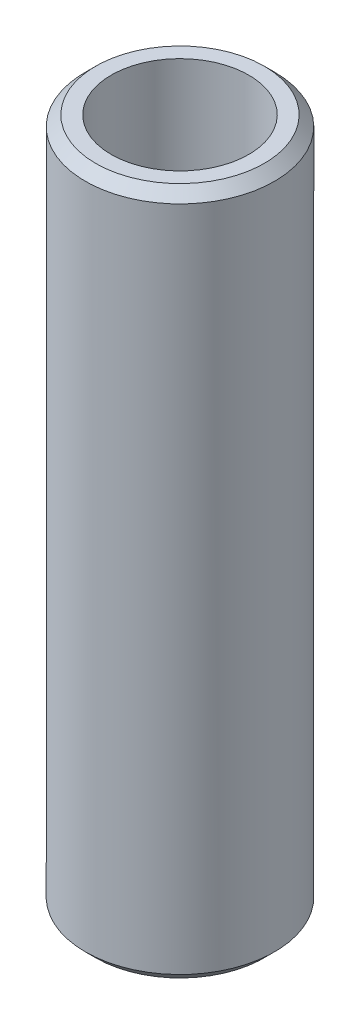
ISO-10303-21;
HEADER;
FILE_DESCRIPTION(('STEP AP214'),'2;1');
FILE_NAME('part.step','',(''),(''),'','','');
FILE_SCHEMA(('AUTOMOTIVE_DESIGN { 1 0 10303 214 1 1 1 1 }'));
ENDSEC;
DATA;
#1=APPLICATION_CONTEXT('core data for automotive mechanical design processes');
#2=APPLICATION_PROTOCOL_DEFINITION('international standard','automotive_design',2000,#1);
#3=PRODUCT_CONTEXT('',#1,'mechanical');
#4=PRODUCT('Part','Part','',(#3));
#5=PRODUCT_RELATED_PRODUCT_CATEGORY('part','',(#4));
#6=PRODUCT_DEFINITION_FORMATION('','',#4);
#7=PRODUCT_DEFINITION_CONTEXT('part definition',#1,'design');
#8=PRODUCT_DEFINITION('design','',#6,#7);
#9=PRODUCT_DEFINITION_SHAPE('','',#8);
#10=(LENGTH_UNIT() NAMED_UNIT(*) SI_UNIT(.MILLI.,.METRE.));
#11=(NAMED_UNIT(*) PLANE_ANGLE_UNIT() SI_UNIT($,.RADIAN.));
#12=(NAMED_UNIT(*) SI_UNIT($,.STERADIAN.) SOLID_ANGLE_UNIT());
#13=UNCERTAINTY_MEASURE_WITH_UNIT(LENGTH_MEASURE(1.E-05),#10,'distance_accuracy_value','');
#14=(GEOMETRIC_REPRESENTATION_CONTEXT(3) GLOBAL_UNCERTAINTY_ASSIGNED_CONTEXT((#13)) GLOBAL_UNIT_ASSIGNED_CONTEXT((#10,
#11,#12)) REPRESENTATION_CONTEXT('',''));
#15=CARTESIAN_POINT('',(0.,0.,0.));
#16=DIRECTION('',(0.,0.,1.));
#17=DIRECTION('',(1.,0.,0.));
#18=AXIS2_PLACEMENT_3D('',#15,#16,#17);
#19=CARTESIAN_POINT('',(0.,20.,0.));
#20=DIRECTION('',(0.,1.,0.));
#21=DIRECTION('',(0.,0.,1.));
#22=AXIS2_PLACEMENT_3D('',#19,#20,#21);
#23=PLANE('',#22);
#24=CARTESIAN_POINT('',(0.,20.,0.));
#25=DIRECTION('',(0.,1.,0.));
#26=DIRECTION('',(0.,0.,1.));
#27=AXIS2_PLACEMENT_3D('',#24,#25,#26);
#28=CIRCLE('',#27,2.44999999999999);
#29=CARTESIAN_POINT('',(0.,20.,-2.45));
#30=VERTEX_POINT('',#29);
#31=EDGE_CURVE('E10',#30,#30,#28,.T.);
#32=ORIENTED_EDGE('',*,*,#31,.T.);
#33=EDGE_LOOP('',(#32));
#34=FACE_BOUND('',#33,.T.);
#35=CARTESIAN_POINT('',(0.,20.,0.));
#36=DIRECTION('',(0.,1.,0.));
#37=DIRECTION('',(0.,0.,1.));
#38=AXIS2_PLACEMENT_3D('',#35,#36,#37);
#39=CIRCLE('',#38,2.);
#40=CARTESIAN_POINT('',(0.,20.,2.));
#41=VERTEX_POINT('',#40);
#42=EDGE_CURVE('E51',#41,#41,#39,.T.);
#43=ORIENTED_EDGE('',*,*,#42,.F.);
#44=EDGE_LOOP('',(#43));
#45=FACE_BOUND('',#44,.T.);
#46=ADVANCED_FACE('F31',(#34,#45),#23,.T.);
#47=CARTESIAN_POINT('',(0.,0.,0.));
#48=DIRECTION('',(0.,1.,0.));
#49=DIRECTION('',(0.,0.,1.));
#50=AXIS2_PLACEMENT_3D('',#47,#48,#49);
#51=PLANE('',#50);
#52=CARTESIAN_POINT('',(0.,0.,0.));
#53=DIRECTION('',(0.,1.,0.));
#54=DIRECTION('',(0.,0.,1.));
#55=AXIS2_PLACEMENT_3D('',#52,#53,#54);
#56=CIRCLE('',#55,2.45);
#57=CARTESIAN_POINT('',(0.,0.,2.45));
#58=VERTEX_POINT('',#57);
#59=EDGE_CURVE('E38',#58,#58,#56,.F.);
#60=ORIENTED_EDGE('',*,*,#59,.T.);
#61=EDGE_LOOP('',(#60));
#62=FACE_BOUND('',#61,.T.);
#63=CARTESIAN_POINT('',(0.,0.,0.));
#64=DIRECTION('',(0.,1.,0.));
#65=DIRECTION('',(0.,0.,1.));
#66=AXIS2_PLACEMENT_3D('',#63,#64,#65);
#67=CIRCLE('',#66,2.);
#68=CARTESIAN_POINT('',(0.,0.,2.));
#69=VERTEX_POINT('',#68);
#70=EDGE_CURVE('E52',#69,#69,#67,.T.);
#71=ORIENTED_EDGE('',*,*,#70,.T.);
#72=EDGE_LOOP('',(#71));
#73=FACE_BOUND('',#72,.T.);
#74=ADVANCED_FACE('F62',(#62,#73),#51,.F.);
#75=CARTESIAN_POINT('',(0.,20.,0.));
#76=DIRECTION('',(0.,-1.,0.));
#77=DIRECTION('',(0.,0.,-1.));
#78=AXIS2_PLACEMENT_3D('',#75,#76,#77);
#79=CYLINDRICAL_SURFACE('',#78,2.75);
#80=CARTESIAN_POINT('',(0.,0.299999999999998,0.));
#81=DIRECTION('',(0.,1.,0.));
#82=DIRECTION('',(0.,0.,1.));
#83=AXIS2_PLACEMENT_3D('',#80,#81,#82);
#84=CIRCLE('',#83,2.75);
#85=CARTESIAN_POINT('',(0.,0.299999999999998,2.75));
#86=VERTEX_POINT('',#85);
#87=EDGE_CURVE('E42',#86,#86,#84,.T.);
#88=ORIENTED_EDGE('',*,*,#87,.T.);
#89=EDGE_LOOP('',(#88));
#90=FACE_BOUND('',#89,.T.);
#91=CARTESIAN_POINT('',(0.,19.7,0.));
#92=DIRECTION('',(0.,1.,0.));
#93=DIRECTION('',(0.,0.,1.));
#94=AXIS2_PLACEMENT_3D('',#91,#92,#93);
#95=CIRCLE('',#94,2.75);
#96=CARTESIAN_POINT('',(0.,19.7,-2.75));
#97=VERTEX_POINT('',#96);
#98=EDGE_CURVE('E46',#97,#97,#95,.F.);
#99=ORIENTED_EDGE('',*,*,#98,.T.);
#100=EDGE_LOOP('',(#99));
#101=FACE_BOUND('',#100,.T.);
#102=ADVANCED_FACE('F67',(#90,#101),#79,.T.);
#103=CARTESIAN_POINT('',(0.,20.,0.));
#104=DIRECTION('',(0.,-1.,0.));
#105=DIRECTION('',(0.,0.,-1.));
#106=AXIS2_PLACEMENT_3D('',#103,#104,#105);
#107=CYLINDRICAL_SURFACE('',#106,2.);
#108=ORIENTED_EDGE('',*,*,#42,.T.);
#109=EDGE_LOOP('',(#108));
#110=FACE_BOUND('',#109,.T.);
#111=ORIENTED_EDGE('',*,*,#70,.F.);
#112=EDGE_LOOP('',(#111));
#113=FACE_BOUND('',#112,.T.);
#114=ADVANCED_FACE('F58',(#110,#113),#107,.F.);
#115=CARTESIAN_POINT('',(0.,0.299999999999998,0.));
#116=DIRECTION('',(0.,1.,0.));
#117=DIRECTION('',(0.,0.,1.));
#118=AXIS2_PLACEMENT_3D('',#115,#116,#117);
#119=CONICAL_SURFACE('',#118,2.75,0.785398163397453);
#120=ORIENTED_EDGE('',*,*,#59,.F.);
#121=EDGE_LOOP('',(#120));
#122=FACE_BOUND('',#121,.T.);
#123=ORIENTED_EDGE('',*,*,#87,.F.);
#124=EDGE_LOOP('',(#123));
#125=FACE_BOUND('',#124,.T.);
#126=ADVANCED_FACE('F73',(#122,#125),#119,.T.);
#127=CARTESIAN_POINT('',(0.,20.,0.));
#128=DIRECTION('',(0.,-1.,0.));
#129=DIRECTION('',(0.,0.,-1.));
#130=AXIS2_PLACEMENT_3D('',#127,#128,#129);
#131=CONICAL_SURFACE('',#130,2.44999999999999,0.78539816339745);
#132=CARTESIAN_POINT('',(0.,19.7,-2.75));
#133=CARTESIAN_POINT('',(0.,19.703125,-2.746875));
#134=CARTESIAN_POINT('',(0.,19.70625,-2.74375));
#135=CARTESIAN_POINT('',(0.,19.7125,-2.7375));
#136=CARTESIAN_POINT('',(0.,19.715625,-2.734375));
#137=CARTESIAN_POINT('',(0.,19.721875,-2.728125));
#138=CARTESIAN_POINT('',(0.,19.725,-2.725));
#139=CARTESIAN_POINT('',(0.,19.73125,-2.71875));
#140=CARTESIAN_POINT('',(0.,19.734375,-2.715625));
#141=CARTESIAN_POINT('',(0.,19.740625,-2.709375));
#142=CARTESIAN_POINT('',(0.,19.74375,-2.70625));
#143=CARTESIAN_POINT('',(0.,19.75,-2.7));
#144=CARTESIAN_POINT('',(0.,19.753125,-2.696875));
#145=CARTESIAN_POINT('',(0.,19.759375,-2.690625));
#146=CARTESIAN_POINT('',(0.,19.7625,-2.6875));
#147=CARTESIAN_POINT('',(0.,19.76875,-2.68125));
#148=CARTESIAN_POINT('',(0.,19.771875,-2.678125));
#149=CARTESIAN_POINT('',(0.,19.778125,-2.671875));
#150=CARTESIAN_POINT('',(0.,19.78125,-2.66875));
#151=CARTESIAN_POINT('',(0.,19.7875,-2.6625));
#152=CARTESIAN_POINT('',(0.,19.790625,-2.659375));
#153=CARTESIAN_POINT('',(0.,19.796875,-2.653125));
#154=CARTESIAN_POINT('',(0.,19.8,-2.65));
#155=CARTESIAN_POINT('',(0.,19.80625,-2.64375));
#156=CARTESIAN_POINT('',(0.,19.809375,-2.640625));
#157=CARTESIAN_POINT('',(0.,19.815625,-2.634375));
#158=CARTESIAN_POINT('',(0.,19.81875,-2.63125));
#159=CARTESIAN_POINT('',(0.,19.825,-2.625));
#160=CARTESIAN_POINT('',(0.,19.828125,-2.621875));
#161=CARTESIAN_POINT('',(0.,19.834375,-2.615625));
#162=CARTESIAN_POINT('',(0.,19.8375,-2.6125));
#163=CARTESIAN_POINT('',(0.,19.84375,-2.60625));
#164=CARTESIAN_POINT('',(0.,19.846875,-2.603125));
#165=CARTESIAN_POINT('',(0.,19.853125,-2.596875));
#166=CARTESIAN_POINT('',(0.,19.85625,-2.59375));
#167=CARTESIAN_POINT('',(0.,19.8625,-2.5875));
#168=CARTESIAN_POINT('',(0.,19.865625,-2.584375));
#169=CARTESIAN_POINT('',(0.,19.871875,-2.578125));
#170=CARTESIAN_POINT('',(0.,19.875,-2.575));
#171=CARTESIAN_POINT('',(0.,19.88125,-2.56875));
#172=CARTESIAN_POINT('',(0.,19.884375,-2.565625));
#173=CARTESIAN_POINT('',(0.,19.890625,-2.559375));
#174=CARTESIAN_POINT('',(0.,19.89375,-2.55625));
#175=CARTESIAN_POINT('',(0.,19.9,-2.55));
#176=CARTESIAN_POINT('',(0.,19.903125,-2.546875));
#177=CARTESIAN_POINT('',(0.,19.909375,-2.540625));
#178=CARTESIAN_POINT('',(0.,19.9125,-2.5375));
#179=CARTESIAN_POINT('',(0.,19.91875,-2.53125));
#180=CARTESIAN_POINT('',(0.,19.921875,-2.528125));
#181=CARTESIAN_POINT('',(0.,19.928125,-2.521875));
#182=CARTESIAN_POINT('',(0.,19.93125,-2.51875));
#183=CARTESIAN_POINT('',(0.,19.9375,-2.5125));
#184=CARTESIAN_POINT('',(0.,19.940625,-2.509375));
#185=CARTESIAN_POINT('',(0.,19.946875,-2.503125));
#186=CARTESIAN_POINT('',(0.,19.95,-2.5));
#187=CARTESIAN_POINT('',(0.,19.95625,-2.49375));
#188=CARTESIAN_POINT('',(0.,19.959375,-2.490625));
#189=CARTESIAN_POINT('',(0.,19.965625,-2.484375));
#190=CARTESIAN_POINT('',(0.,19.96875,-2.48125));
#191=CARTESIAN_POINT('',(0.,19.975,-2.475));
#192=CARTESIAN_POINT('',(0.,19.978125,-2.471875));
#193=CARTESIAN_POINT('',(0.,19.984375,-2.465625));
#194=CARTESIAN_POINT('',(0.,19.9875,-2.4625));
#195=CARTESIAN_POINT('',(0.,19.99375,-2.45625));
#196=CARTESIAN_POINT('',(0.,19.996875,-2.45312499999999));
#197=CARTESIAN_POINT('',(0.,20.,-2.45));
#198=B_SPLINE_CURVE_WITH_KNOTS('',3,(#132,#133,#134,#135,#136,#137,#138,#139,#140,#141,#142,
#143,#144,#145,#146,#147,#148,#149,#150,#151,#152,#153,#154,#155,#156,#157,#158,#159,#160,#161,
#162,#163,#164,#165,#166,#167,#168,#169,#170,#171,#172,#173,#174,#175,#176,#177,#178,#179,#180,
#181,#182,#183,#184,#185,#186,#187,#188,#189,#190,#191,#192,#193,#194,#195,#196,#197),
.UNSPECIFIED.,.F.,.F.,(4,2,2,2,2,2,2,2,2,2,2,2,2,2,2,2,2,2,2,2,2,2,2,2,2,2,2,2,2,2,2,2,4),(0.,
0.0132582521472497,0.0265165042944966,0.0397747564417463,0.0530330085889935,0.0662912607362407,
0.0795495128834904,0.0928077650307376,0.106066017177985,0.119324269325234,0.132582521472481,
0.145840773619729,0.159099025766978,0.172357277914225,0.185615530061472,0.198873782208722,
0.212132034355969,0.225390286503217,0.238648538650466,0.251906790797713,0.26516504294496,
0.27842329509221,0.291681547239457,0.304939799386705,0.318198051533954,0.331456303681201,
0.344714555828448,0.357972807975698,0.371231060122945,0.384489312270193,0.397747564417442,
0.411005816564689,0.424264068711939),.UNSPECIFIED.);
#199=EDGE_CURVE('BSEAM33',#97,#30,#198,.T.);
#200=ORIENTED_EDGE('',*,*,#98,.F.);
#201=ORIENTED_EDGE('',*,*,#31,.F.);
#202=ORIENTED_EDGE('',*,*,#199,.T.);
#203=ORIENTED_EDGE('',*,*,#199,.F.);
#204=EDGE_LOOP('',(#200,#202,#201,#203));
#205=FACE_BOUND('',#204,.T.);
#206=ADVANCED_FACE('F33',(#205),#131,.T.);
#207=CLOSED_SHELL('',(#46,#74,#102,#114,#126,#206));
#208=MANIFOLD_SOLID_BREP('B2',#207);
#209=ADVANCED_BREP_SHAPE_REPRESENTATION('',(#18,#208),#14);
#210=SHAPE_DEFINITION_REPRESENTATION(#9,#209);
ENDSEC;
END-ISO-10303-21;
